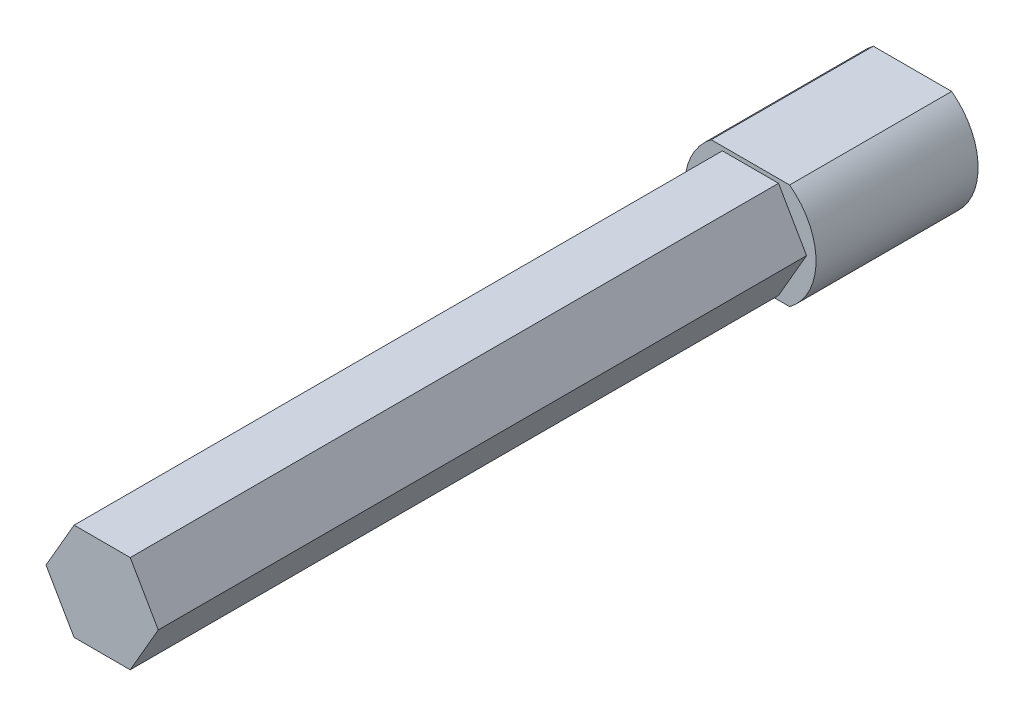
ISO-10303-21;
HEADER;
FILE_DESCRIPTION(('STEP AP214'),'2;1');
FILE_NAME('part.step','',(''),(''),'','','');
FILE_SCHEMA(('AUTOMOTIVE_DESIGN { 1 0 10303 214 1 1 1 1 }'));
ENDSEC;
DATA;
#1=APPLICATION_CONTEXT('core data for automotive mechanical design processes');
#2=APPLICATION_PROTOCOL_DEFINITION('international standard','automotive_design',2000,#1);
#3=PRODUCT_CONTEXT('',#1,'mechanical');
#4=PRODUCT('Part','Part','',(#3));
#5=PRODUCT_RELATED_PRODUCT_CATEGORY('part','',(#4));
#6=PRODUCT_DEFINITION_FORMATION('','',#4);
#7=PRODUCT_DEFINITION_CONTEXT('part definition',#1,'design');
#8=PRODUCT_DEFINITION('design','',#6,#7);
#9=PRODUCT_DEFINITION_SHAPE('','',#8);
#10=(LENGTH_UNIT() NAMED_UNIT(*) SI_UNIT(.MILLI.,.METRE.));
#11=(NAMED_UNIT(*) PLANE_ANGLE_UNIT() SI_UNIT($,.RADIAN.));
#12=(NAMED_UNIT(*) SI_UNIT($,.STERADIAN.) SOLID_ANGLE_UNIT());
#13=UNCERTAINTY_MEASURE_WITH_UNIT(LENGTH_MEASURE(1.E-05),#10,'distance_accuracy_value','');
#14=(GEOMETRIC_REPRESENTATION_CONTEXT(3) GLOBAL_UNCERTAINTY_ASSIGNED_CONTEXT((#13)) GLOBAL_UNIT_ASSIGNED_CONTEXT((#10,
#11,#12)) REPRESENTATION_CONTEXT('',''));
#15=CARTESIAN_POINT('',(0.,0.,0.));
#16=DIRECTION('',(0.,0.,1.));
#17=DIRECTION('',(1.,0.,0.));
#18=AXIS2_PLACEMENT_3D('',#15,#16,#17);
#19=CARTESIAN_POINT('',(0.,0.,10.));
#20=DIRECTION('',(0.,0.,-1.));
#21=DIRECTION('',(-1.,0.,0.));
#22=AXIS2_PLACEMENT_3D('',#19,#20,#21);
#23=CYLINDRICAL_SURFACE('',#22,4.05);
#24=CARTESIAN_POINT('',(0.,0.,0.));
#25=DIRECTION('',(0.,0.,1.));
#26=DIRECTION('',(1.,0.,0.));
#27=AXIS2_PLACEMENT_3D('',#24,#25,#26);
#28=CIRCLE('',#27,4.05);
#29=CARTESIAN_POINT('',(-2.41660919471891,3.25,0.));
#30=VERTEX_POINT('',#29);
#31=CARTESIAN_POINT('',(-2.41660919471891,-3.25,0.));
#32=VERTEX_POINT('',#31);
#33=EDGE_CURVE('E260',#30,#32,#28,.T.);
#34=ORIENTED_EDGE('',*,*,#33,.T.);
#35=DIRECTION('',(0.,0.,-1.));
#36=VECTOR('',#35,1.);
#37=CARTESIAN_POINT('',(-2.41660919471891,-3.25,10.));
#38=LINE('',#37,#36);
#39=CARTESIAN_POINT('',(-2.41660919471891,-3.25,10.));
#40=VERTEX_POINT('',#39);
#41=EDGE_CURVE('E11',#40,#32,#38,.T.);
#42=ORIENTED_EDGE('',*,*,#41,.F.);
#43=CARTESIAN_POINT('',(0.,0.,10.));
#44=DIRECTION('',(0.,0.,1.));
#45=DIRECTION('',(1.,0.,0.));
#46=AXIS2_PLACEMENT_3D('',#43,#44,#45);
#47=CIRCLE('',#46,4.05);
#48=CARTESIAN_POINT('',(-2.41660919471891,3.25,10.));
#49=VERTEX_POINT('',#48);
#50=EDGE_CURVE('E261',#49,#40,#47,.T.);
#51=ORIENTED_EDGE('',*,*,#50,.F.);
#52=DIRECTION('',(0.,0.,-1.));
#53=VECTOR('',#52,1.);
#54=CARTESIAN_POINT('',(-2.41660919471891,3.25,10.));
#55=LINE('',#54,#53);
#56=EDGE_CURVE('E275',#49,#30,#55,.T.);
#57=ORIENTED_EDGE('',*,*,#56,.T.);
#58=EDGE_LOOP('',(#34,#42,#51,#57));
#59=FACE_BOUND('',#58,.T.);
#60=ADVANCED_FACE('F45',(#59),#23,.T.);
#61=CARTESIAN_POINT('',(-2.41660919471891,-3.25,10.));
#62=DIRECTION('',(0.,1.,0.));
#63=DIRECTION('',(0.,0.,1.));
#64=AXIS2_PLACEMENT_3D('',#61,#62,#63);
#65=PLANE('',#64);
#66=DIRECTION('',(1.,0.,0.));
#67=VECTOR('',#66,1.);
#68=CARTESIAN_POINT('',(-2.41660919471891,-3.25,0.));
#69=LINE('',#68,#67);
#70=CARTESIAN_POINT('',(2.41660919471891,-3.25,0.));
#71=VERTEX_POINT('',#70);
#72=EDGE_CURVE('E279',#32,#71,#69,.T.);
#73=ORIENTED_EDGE('',*,*,#72,.T.);
#74=DIRECTION('',(0.,0.,-1.));
#75=VECTOR('',#74,1.);
#76=CARTESIAN_POINT('',(2.41660919471891,-3.25,10.));
#77=LINE('',#76,#75);
#78=CARTESIAN_POINT('',(2.41660919471891,-3.25,10.));
#79=VERTEX_POINT('',#78);
#80=EDGE_CURVE('E53',#79,#71,#77,.T.);
#81=ORIENTED_EDGE('',*,*,#80,.F.);
#82=DIRECTION('',(1.,0.,0.));
#83=VECTOR('',#82,1.);
#84=CARTESIAN_POINT('',(-2.41660919471891,-3.25,10.));
#85=LINE('',#84,#83);
#86=EDGE_CURVE('E265',#40,#79,#85,.T.);
#87=ORIENTED_EDGE('',*,*,#86,.F.);
#88=ORIENTED_EDGE('',*,*,#41,.T.);
#89=EDGE_LOOP('',(#73,#81,#87,#88));
#90=FACE_BOUND('',#89,.T.);
#91=ADVANCED_FACE('F315',(#90),#65,.F.);
#92=CARTESIAN_POINT('',(0.,0.,10.));
#93=DIRECTION('',(0.,0.,-1.));
#94=DIRECTION('',(-1.,0.,0.));
#95=AXIS2_PLACEMENT_3D('',#92,#93,#94);
#96=CYLINDRICAL_SURFACE('',#95,4.05);
#97=CARTESIAN_POINT('',(0.,0.,0.));
#98=DIRECTION('',(0.,0.,1.));
#99=DIRECTION('',(1.,0.,0.));
#100=AXIS2_PLACEMENT_3D('',#97,#98,#99);
#101=CIRCLE('',#100,4.05);
#102=CARTESIAN_POINT('',(2.41660919471891,3.25,0.));
#103=VERTEX_POINT('',#102);
#104=EDGE_CURVE('E282',#71,#103,#101,.T.);
#105=ORIENTED_EDGE('',*,*,#104,.T.);
#106=DIRECTION('',(0.,0.,-1.));
#107=VECTOR('',#106,1.);
#108=CARTESIAN_POINT('',(2.41660919471891,3.25,10.));
#109=LINE('',#108,#107);
#110=CARTESIAN_POINT('',(2.41660919471891,3.25,10.));
#111=VERTEX_POINT('',#110);
#112=EDGE_CURVE('E290',#111,#103,#109,.T.);
#113=ORIENTED_EDGE('',*,*,#112,.F.);
#114=CARTESIAN_POINT('',(0.,0.,10.));
#115=DIRECTION('',(0.,0.,1.));
#116=DIRECTION('',(1.,0.,0.));
#117=AXIS2_PLACEMENT_3D('',#114,#115,#116);
#118=CIRCLE('',#117,4.05);
#119=EDGE_CURVE('E269',#79,#111,#118,.T.);
#120=ORIENTED_EDGE('',*,*,#119,.F.);
#121=ORIENTED_EDGE('',*,*,#80,.T.);
#122=EDGE_LOOP('',(#105,#113,#120,#121));
#123=FACE_BOUND('',#122,.T.);
#124=ADVANCED_FACE('F299',(#123),#96,.T.);
#125=CARTESIAN_POINT('',(-2.41660919471891,3.25,10.));
#126=DIRECTION('',(0.,-1.,0.));
#127=DIRECTION('',(0.,0.,-1.));
#128=AXIS2_PLACEMENT_3D('',#125,#126,#127);
#129=PLANE('',#128);
#130=DIRECTION('',(-1.,0.,0.));
#131=VECTOR('',#130,1.);
#132=CARTESIAN_POINT('',(-2.41660919471891,3.25,0.));
#133=LINE('',#132,#131);
#134=EDGE_CURVE('E266',#103,#30,#133,.T.);
#135=ORIENTED_EDGE('',*,*,#134,.T.);
#136=ORIENTED_EDGE('',*,*,#56,.F.);
#137=DIRECTION('',(-1.,0.,0.));
#138=VECTOR('',#137,1.);
#139=CARTESIAN_POINT('',(-2.41660919471891,3.25,10.));
#140=LINE('',#139,#138);
#141=EDGE_CURVE('E272',#111,#49,#140,.T.);
#142=ORIENTED_EDGE('',*,*,#141,.F.);
#143=ORIENTED_EDGE('',*,*,#112,.T.);
#144=EDGE_LOOP('',(#135,#136,#142,#143));
#145=FACE_BOUND('',#144,.T.);
#146=ADVANCED_FACE('F308',(#145),#129,.F.);
#147=CARTESIAN_POINT('',(0.,0.,10.));
#148=DIRECTION('',(0.,0.,1.));
#149=DIRECTION('',(1.,0.,0.));
#150=AXIS2_PLACEMENT_3D('',#147,#148,#149);
#151=PLANE('',#150);
#152=DIRECTION('',(0.999999819928611,-0.000600118943034689,0.));
#153=VECTOR('',#152,1.);
#154=CARTESIAN_POINT('',(-1.73385085250519,-2.99896002328591,10.));
#155=LINE('',#154,#153);
#156=CARTESIAN_POINT('',(-1.73385085250519,-2.99896002328591,10.));
#157=VERTEX_POINT('',#156);
#158=CARTESIAN_POINT('',(1.73025013884698,-3.00103889628575,10.));
#159=VERTEX_POINT('',#158);
#160=EDGE_CURVE('E68',#157,#159,#155,.T.);
#161=ORIENTED_EDGE('',*,*,#160,.F.);
#162=DIRECTION('',(0.499480191714345,-0.866325307309559,0.));
#163=VECTOR('',#162,1.);
#164=CARTESIAN_POINT('',(-3.46410099135217,0.00207887299984251,10.));
#165=LINE('',#164,#163);
#166=CARTESIAN_POINT('',(-3.46410099135217,0.00207887299984251,10.));
#167=VERTEX_POINT('',#166);
#168=EDGE_CURVE('E201',#167,#157,#165,.T.);
#169=ORIENTED_EDGE('',*,*,#168,.F.);
#170=DIRECTION('',(-0.500519628214266,-0.865725188366524,0.));
#171=VECTOR('',#170,1.);
#172=CARTESIAN_POINT('',(-1.73025013884698,3.00103889628575,10.));
#173=LINE('',#172,#171);
#174=CARTESIAN_POINT('',(-1.73025013884698,3.00103889628575,10.));
#175=VERTEX_POINT('',#174);
#176=EDGE_CURVE('E231',#175,#167,#173,.T.);
#177=ORIENTED_EDGE('',*,*,#176,.F.);
#178=DIRECTION('',(-0.999999819928611,0.000600118943034564,0.));
#179=VECTOR('',#178,1.);
#180=CARTESIAN_POINT('',(1.73385085250519,2.99896002328591,10.));
#181=LINE('',#180,#179);
#182=CARTESIAN_POINT('',(1.73385085250519,2.99896002328591,10.));
#183=VERTEX_POINT('',#182);
#184=EDGE_CURVE('E227',#183,#175,#181,.T.);
#185=ORIENTED_EDGE('',*,*,#184,.F.);
#186=DIRECTION('',(-0.499480191714345,0.866325307309558,0.));
#187=VECTOR('',#186,1.);
#188=CARTESIAN_POINT('',(3.46410099135216,-0.00207887299984231,10.));
#189=LINE('',#188,#187);
#190=CARTESIAN_POINT('',(3.46410099135216,-0.00207887299984231,10.));
#191=VERTEX_POINT('',#190);
#192=EDGE_CURVE('E223',#191,#183,#189,.T.);
#193=ORIENTED_EDGE('',*,*,#192,.F.);
#194=DIRECTION('',(0.500519628214266,0.865725188366524,0.));
#195=VECTOR('',#194,1.);
#196=CARTESIAN_POINT('',(1.73025013884698,-3.00103889628575,10.));
#197=LINE('',#196,#195);
#198=EDGE_CURVE('E219',#159,#191,#197,.T.);
#199=ORIENTED_EDGE('',*,*,#198,.F.);
#200=EDGE_LOOP('',(#161,#169,#177,#185,#193,#199));
#201=FACE_BOUND('',#200,.T.);
#202=ORIENTED_EDGE('',*,*,#50,.T.);
#203=ORIENTED_EDGE('',*,*,#86,.T.);
#204=ORIENTED_EDGE('',*,*,#119,.T.);
#205=ORIENTED_EDGE('',*,*,#141,.T.);
#206=EDGE_LOOP('',(#202,#203,#204,#205));
#207=FACE_BOUND('',#206,.T.);
#208=ADVANCED_FACE('F314',(#201,#207),#151,.T.);
#209=CARTESIAN_POINT('',(0.,0.,0.));
#210=DIRECTION('',(0.,0.,1.));
#211=DIRECTION('',(1.,0.,0.));
#212=AXIS2_PLACEMENT_3D('',#209,#210,#211);
#213=PLANE('',#212);
#214=DIRECTION('',(1.,0.,0.));
#215=VECTOR('',#214,1.);
#216=CARTESIAN_POINT('',(-2.1540659228538,2.5,0.));
#217=LINE('',#216,#215);
#218=CARTESIAN_POINT('',(-2.1540659228538,2.5,0.));
#219=VERTEX_POINT('',#218);
#220=CARTESIAN_POINT('',(2.1540659228538,2.5,0.));
#221=VERTEX_POINT('',#220);
#222=EDGE_CURVE('E182',#219,#221,#217,.T.);
#223=ORIENTED_EDGE('',*,*,#222,.F.);
#224=CARTESIAN_POINT('',(0.,0.,0.));
#225=DIRECTION('',(0.,0.,-1.));
#226=DIRECTION('',(-1.,0.,0.));
#227=AXIS2_PLACEMENT_3D('',#224,#225,#226);
#228=CIRCLE('',#227,3.3);
#229=CARTESIAN_POINT('',(-2.1540659228538,-2.5,0.));
#230=VERTEX_POINT('',#229);
#231=EDGE_CURVE('E60',#230,#219,#228,.T.);
#232=ORIENTED_EDGE('',*,*,#231,.F.);
#233=DIRECTION('',(-1.,0.,0.));
#234=VECTOR('',#233,1.);
#235=CARTESIAN_POINT('',(2.1540659228538,-2.5,0.));
#236=LINE('',#235,#234);
#237=CARTESIAN_POINT('',(2.1540659228538,-2.5,0.));
#238=VERTEX_POINT('',#237);
#239=EDGE_CURVE('E169',#238,#230,#236,.T.);
#240=ORIENTED_EDGE('',*,*,#239,.F.);
#241=CARTESIAN_POINT('',(0.,0.,0.));
#242=DIRECTION('',(0.,0.,-1.));
#243=DIRECTION('',(-1.,0.,0.));
#244=AXIS2_PLACEMENT_3D('',#241,#242,#243);
#245=CIRCLE('',#244,3.3);
#246=EDGE_CURVE('E173',#221,#238,#245,.T.);
#247=ORIENTED_EDGE('',*,*,#246,.F.);
#248=EDGE_LOOP('',(#223,#232,#240,#247));
#249=FACE_BOUND('',#248,.T.);
#250=ORIENTED_EDGE('',*,*,#33,.F.);
#251=ORIENTED_EDGE('',*,*,#134,.F.);
#252=ORIENTED_EDGE('',*,*,#104,.F.);
#253=ORIENTED_EDGE('',*,*,#72,.F.);
#254=EDGE_LOOP('',(#250,#251,#252,#253));
#255=FACE_BOUND('',#254,.T.);
#256=ADVANCED_FACE('F305',(#249,#255),#213,.F.);
#257=CARTESIAN_POINT('',(-1.73385085250519,-2.99896002328591,50.));
#258=DIRECTION('',(0.000600118943034689,0.999999819928611,0.));
#259=DIRECTION('',(-0.999999819928611,0.000600118943034689,0.));
#260=AXIS2_PLACEMENT_3D('',#257,#258,#259);
#261=PLANE('',#260);
#262=ORIENTED_EDGE('',*,*,#160,.T.);
#263=DIRECTION('',(0.,0.,-1.));
#264=VECTOR('',#263,1.);
#265=CARTESIAN_POINT('',(1.73025013884698,-3.00103889628575,50.));
#266=LINE('',#265,#264);
#267=CARTESIAN_POINT('',(1.73025013884698,-3.00103889628575,50.));
#268=VERTEX_POINT('',#267);
#269=EDGE_CURVE('E256',#268,#159,#266,.T.);
#270=ORIENTED_EDGE('',*,*,#269,.F.);
#271=DIRECTION('',(0.999999819928611,-0.000600118943034689,0.));
#272=VECTOR('',#271,1.);
#273=CARTESIAN_POINT('',(-1.73385085250519,-2.99896002328591,50.));
#274=LINE('',#273,#272);
#275=CARTESIAN_POINT('',(-1.73385085250519,-2.99896002328591,50.));
#276=VERTEX_POINT('',#275);
#277=EDGE_CURVE('E196',#276,#268,#274,.T.);
#278=ORIENTED_EDGE('',*,*,#277,.F.);
#279=DIRECTION('',(0.,0.,-1.));
#280=VECTOR('',#279,1.);
#281=CARTESIAN_POINT('',(-1.73385085250519,-2.99896002328591,50.));
#282=LINE('',#281,#280);
#283=EDGE_CURVE('E216',#276,#157,#282,.T.);
#284=ORIENTED_EDGE('',*,*,#283,.T.);
#285=EDGE_LOOP('',(#262,#270,#278,#284));
#286=FACE_BOUND('',#285,.T.);
#287=ADVANCED_FACE('F327',(#286),#261,.F.);
#288=CARTESIAN_POINT('',(1.73025013884698,-3.00103889628575,50.));
#289=DIRECTION('',(-0.865725188366524,0.500519628214266,0.));
#290=DIRECTION('',(-0.500519628214266,-0.865725188366524,0.));
#291=AXIS2_PLACEMENT_3D('',#288,#289,#290);
#292=PLANE('',#291);
#293=ORIENTED_EDGE('',*,*,#198,.T.);
#294=DIRECTION('',(0.,0.,-1.));
#295=VECTOR('',#294,1.);
#296=CARTESIAN_POINT('',(3.46410099135216,-0.00207887299984231,50.));
#297=LINE('',#296,#295);
#298=CARTESIAN_POINT('',(3.46410099135216,-0.00207887299984231,50.));
#299=VERTEX_POINT('',#298);
#300=EDGE_CURVE('E252',#299,#191,#297,.T.);
#301=ORIENTED_EDGE('',*,*,#300,.F.);
#302=DIRECTION('',(0.500519628214266,0.865725188366524,0.));
#303=VECTOR('',#302,1.);
#304=CARTESIAN_POINT('',(1.73025013884698,-3.00103889628575,50.));
#305=LINE('',#304,#303);
#306=EDGE_CURVE('E200',#268,#299,#305,.T.);
#307=ORIENTED_EDGE('',*,*,#306,.F.);
#308=ORIENTED_EDGE('',*,*,#269,.T.);
#309=EDGE_LOOP('',(#293,#301,#307,#308));
#310=FACE_BOUND('',#309,.T.);
#311=ADVANCED_FACE('F333',(#310),#292,.F.);
#312=CARTESIAN_POINT('',(3.46410099135216,-0.00207887299984231,50.));
#313=DIRECTION('',(-0.866325307309558,-0.499480191714345,0.));
#314=DIRECTION('',(0.499480191714345,-0.866325307309558,0.));
#315=AXIS2_PLACEMENT_3D('',#312,#313,#314);
#316=PLANE('',#315);
#317=ORIENTED_EDGE('',*,*,#192,.T.);
#318=DIRECTION('',(0.,0.,-1.));
#319=VECTOR('',#318,1.);
#320=CARTESIAN_POINT('',(1.73385085250519,2.99896002328591,50.));
#321=LINE('',#320,#319);
#322=CARTESIAN_POINT('',(1.73385085250519,2.99896002328591,50.));
#323=VERTEX_POINT('',#322);
#324=EDGE_CURVE('E248',#323,#183,#321,.T.);
#325=ORIENTED_EDGE('',*,*,#324,.F.);
#326=DIRECTION('',(-0.499480191714345,0.866325307309558,0.));
#327=VECTOR('',#326,1.);
#328=CARTESIAN_POINT('',(3.46410099135216,-0.00207887299984231,50.));
#329=LINE('',#328,#327);
#330=EDGE_CURVE('E204',#299,#323,#329,.T.);
#331=ORIENTED_EDGE('',*,*,#330,.F.);
#332=ORIENTED_EDGE('',*,*,#300,.T.);
#333=EDGE_LOOP('',(#317,#325,#331,#332));
#334=FACE_BOUND('',#333,.T.);
#335=ADVANCED_FACE('F337',(#334),#316,.F.);
#336=CARTESIAN_POINT('',(1.73385085250519,2.99896002328591,50.));
#337=DIRECTION('',(-0.000600118943034564,-0.999999819928611,0.));
#338=DIRECTION('',(0.999999819928611,-0.000600118943034564,0.));
#339=AXIS2_PLACEMENT_3D('',#336,#337,#338);
#340=PLANE('',#339);
#341=ORIENTED_EDGE('',*,*,#184,.T.);
#342=DIRECTION('',(0.,0.,-1.));
#343=VECTOR('',#342,1.);
#344=CARTESIAN_POINT('',(-1.73025013884698,3.00103889628575,50.));
#345=LINE('',#344,#343);
#346=CARTESIAN_POINT('',(-1.73025013884698,3.00103889628575,50.));
#347=VERTEX_POINT('',#346);
#348=EDGE_CURVE('E244',#347,#175,#345,.T.);
#349=ORIENTED_EDGE('',*,*,#348,.F.);
#350=DIRECTION('',(-0.999999819928611,0.000600118943034564,0.));
#351=VECTOR('',#350,1.);
#352=CARTESIAN_POINT('',(1.73385085250519,2.99896002328591,50.));
#353=LINE('',#352,#351);
#354=EDGE_CURVE('E207',#323,#347,#353,.T.);
#355=ORIENTED_EDGE('',*,*,#354,.F.);
#356=ORIENTED_EDGE('',*,*,#324,.T.);
#357=EDGE_LOOP('',(#341,#349,#355,#356));
#358=FACE_BOUND('',#357,.T.);
#359=ADVANCED_FACE('F341',(#358),#340,.F.);
#360=CARTESIAN_POINT('',(-1.73025013884698,3.00103889628575,50.));
#361=DIRECTION('',(0.865725188366524,-0.500519628214266,0.));
#362=DIRECTION('',(0.500519628214266,0.865725188366524,0.));
#363=AXIS2_PLACEMENT_3D('',#360,#361,#362);
#364=PLANE('',#363);
#365=ORIENTED_EDGE('',*,*,#176,.T.);
#366=DIRECTION('',(0.,0.,-1.));
#367=VECTOR('',#366,1.);
#368=CARTESIAN_POINT('',(-3.46410099135217,0.00207887299984251,50.));
#369=LINE('',#368,#367);
#370=CARTESIAN_POINT('',(-3.46410099135217,0.00207887299984251,50.));
#371=VERTEX_POINT('',#370);
#372=EDGE_CURVE('E240',#371,#167,#369,.T.);
#373=ORIENTED_EDGE('',*,*,#372,.F.);
#374=DIRECTION('',(-0.500519628214266,-0.865725188366524,0.));
#375=VECTOR('',#374,1.);
#376=CARTESIAN_POINT('',(-1.73025013884698,3.00103889628575,50.));
#377=LINE('',#376,#375);
#378=EDGE_CURVE('E210',#347,#371,#377,.T.);
#379=ORIENTED_EDGE('',*,*,#378,.F.);
#380=ORIENTED_EDGE('',*,*,#348,.T.);
#381=EDGE_LOOP('',(#365,#373,#379,#380));
#382=FACE_BOUND('',#381,.T.);
#383=ADVANCED_FACE('F345',(#382),#364,.F.);
#384=CARTESIAN_POINT('',(-3.46410099135217,0.00207887299984251,50.));
#385=DIRECTION('',(0.866325307309559,0.499480191714345,0.));
#386=DIRECTION('',(-0.499480191714345,0.866325307309559,0.));
#387=AXIS2_PLACEMENT_3D('',#384,#385,#386);
#388=PLANE('',#387);
#389=ORIENTED_EDGE('',*,*,#168,.T.);
#390=ORIENTED_EDGE('',*,*,#283,.F.);
#391=DIRECTION('',(0.499480191714345,-0.866325307309559,0.));
#392=VECTOR('',#391,1.);
#393=CARTESIAN_POINT('',(-3.46410099135217,0.00207887299984251,50.));
#394=LINE('',#393,#392);
#395=EDGE_CURVE('E213',#371,#276,#394,.T.);
#396=ORIENTED_EDGE('',*,*,#395,.F.);
#397=ORIENTED_EDGE('',*,*,#372,.T.);
#398=EDGE_LOOP('',(#389,#390,#396,#397));
#399=FACE_BOUND('',#398,.T.);
#400=ADVANCED_FACE('F349',(#399),#388,.F.);
#401=CARTESIAN_POINT('',(0.,0.,50.));
#402=DIRECTION('',(0.,0.,1.));
#403=DIRECTION('',(1.,0.,0.));
#404=AXIS2_PLACEMENT_3D('',#401,#402,#403);
#405=PLANE('',#404);
#406=ORIENTED_EDGE('',*,*,#277,.T.);
#407=ORIENTED_EDGE('',*,*,#306,.T.);
#408=ORIENTED_EDGE('',*,*,#330,.T.);
#409=ORIENTED_EDGE('',*,*,#354,.T.);
#410=ORIENTED_EDGE('',*,*,#378,.T.);
#411=ORIENTED_EDGE('',*,*,#395,.T.);
#412=EDGE_LOOP('',(#406,#407,#408,#409,#410,#411));
#413=FACE_BOUND('',#412,.T.);
#414=ADVANCED_FACE('F353',(#413),#405,.T.);
#415=CARTESIAN_POINT('',(0.,0.,5.));
#416=DIRECTION('',(0.,0.,-1.));
#417=DIRECTION('',(-1.,0.,0.));
#418=AXIS2_PLACEMENT_3D('',#415,#416,#417);
#419=CYLINDRICAL_SURFACE('',#418,3.3);
#420=ORIENTED_EDGE('',*,*,#231,.T.);
#421=DIRECTION('',(0.,0.,-1.));
#422=VECTOR('',#421,1.);
#423=CARTESIAN_POINT('',(-2.1540659228538,2.5,5.));
#424=LINE('',#423,#422);
#425=CARTESIAN_POINT('',(-2.1540659228538,2.5,5.));
#426=VERTEX_POINT('',#425);
#427=EDGE_CURVE('E144',#426,#219,#424,.T.);
#428=ORIENTED_EDGE('',*,*,#427,.F.);
#429=CARTESIAN_POINT('',(0.,0.,5.));
#430=DIRECTION('',(0.,0.,-1.));
#431=DIRECTION('',(-1.,0.,0.));
#432=AXIS2_PLACEMENT_3D('',#429,#430,#431);
#433=CIRCLE('',#432,3.3);
#434=CARTESIAN_POINT('',(-2.1540659228538,-2.5,5.));
#435=VERTEX_POINT('',#434);
#436=EDGE_CURVE('E148',#435,#426,#433,.T.);
#437=ORIENTED_EDGE('',*,*,#436,.F.);
#438=DIRECTION('',(0.,0.,-1.));
#439=VECTOR('',#438,1.);
#440=CARTESIAN_POINT('',(-2.1540659228538,-2.5,5.));
#441=LINE('',#440,#439);
#442=EDGE_CURVE('E188',#435,#230,#441,.T.);
#443=ORIENTED_EDGE('',*,*,#442,.T.);
#444=EDGE_LOOP('',(#420,#428,#437,#443));
#445=FACE_BOUND('',#444,.T.);
#446=ADVANCED_FACE('F146',(#445),#419,.F.);
#447=CARTESIAN_POINT('',(2.1540659228538,-2.5,5.));
#448=DIRECTION('',(0.,-1.,0.));
#449=DIRECTION('',(0.,0.,-1.));
#450=AXIS2_PLACEMENT_3D('',#447,#448,#449);
#451=PLANE('',#450);
#452=ORIENTED_EDGE('',*,*,#239,.T.);
#453=ORIENTED_EDGE('',*,*,#442,.F.);
#454=DIRECTION('',(-1.,0.,0.));
#455=VECTOR('',#454,1.);
#456=CARTESIAN_POINT('',(2.1540659228538,-2.5,5.));
#457=LINE('',#456,#455);
#458=CARTESIAN_POINT('',(2.1540659228538,-2.5,5.));
#459=VERTEX_POINT('',#458);
#460=EDGE_CURVE('E155',#459,#435,#457,.T.);
#461=ORIENTED_EDGE('',*,*,#460,.F.);
#462=DIRECTION('',(0.,0.,-1.));
#463=VECTOR('',#462,1.);
#464=CARTESIAN_POINT('',(2.1540659228538,-2.5,5.));
#465=LINE('',#464,#463);
#466=EDGE_CURVE('E191',#459,#238,#465,.T.);
#467=ORIENTED_EDGE('',*,*,#466,.T.);
#468=EDGE_LOOP('',(#452,#453,#461,#467));
#469=FACE_BOUND('',#468,.T.);
#470=ADVANCED_FACE('F360',(#469),#451,.F.);
#471=CARTESIAN_POINT('',(0.,0.,5.));
#472=DIRECTION('',(0.,0.,-1.));
#473=DIRECTION('',(-1.,0.,0.));
#474=AXIS2_PLACEMENT_3D('',#471,#472,#473);
#475=CYLINDRICAL_SURFACE('',#474,3.3);
#476=ORIENTED_EDGE('',*,*,#246,.T.);
#477=ORIENTED_EDGE('',*,*,#466,.F.);
#478=CARTESIAN_POINT('',(0.,0.,5.));
#479=DIRECTION('',(0.,0.,-1.));
#480=DIRECTION('',(-1.,0.,0.));
#481=AXIS2_PLACEMENT_3D('',#478,#479,#480);
#482=CIRCLE('',#481,3.3);
#483=CARTESIAN_POINT('',(2.1540659228538,2.5,5.));
#484=VERTEX_POINT('',#483);
#485=EDGE_CURVE('E164',#484,#459,#482,.T.);
#486=ORIENTED_EDGE('',*,*,#485,.F.);
#487=DIRECTION('',(0.,0.,-1.));
#488=VECTOR('',#487,1.);
#489=CARTESIAN_POINT('',(2.1540659228538,2.5,5.));
#490=LINE('',#489,#488);
#491=EDGE_CURVE('E154',#484,#221,#490,.T.);
#492=ORIENTED_EDGE('',*,*,#491,.T.);
#493=EDGE_LOOP('',(#476,#477,#486,#492));
#494=FACE_BOUND('',#493,.T.);
#495=ADVANCED_FACE('F363',(#494),#475,.F.);
#496=CARTESIAN_POINT('',(-2.1540659228538,2.5,5.));
#497=DIRECTION('',(0.,1.,0.));
#498=DIRECTION('',(0.,0.,1.));
#499=AXIS2_PLACEMENT_3D('',#496,#497,#498);
#500=PLANE('',#499);
#501=ORIENTED_EDGE('',*,*,#222,.T.);
#502=ORIENTED_EDGE('',*,*,#491,.F.);
#503=DIRECTION('',(1.,0.,0.));
#504=VECTOR('',#503,1.);
#505=CARTESIAN_POINT('',(-2.1540659228538,2.5,5.));
#506=LINE('',#505,#504);
#507=EDGE_CURVE('E158',#426,#484,#506,.T.);
#508=ORIENTED_EDGE('',*,*,#507,.F.);
#509=ORIENTED_EDGE('',*,*,#427,.T.);
#510=EDGE_LOOP('',(#501,#502,#508,#509));
#511=FACE_BOUND('',#510,.T.);
#512=ADVANCED_FACE('F159',(#511),#500,.F.);
#513=CARTESIAN_POINT('',(0.,0.,5.));
#514=DIRECTION('',(0.,0.,-1.));
#515=DIRECTION('',(-1.,0.,0.));
#516=AXIS2_PLACEMENT_3D('',#513,#514,#515);
#517=PLANE('',#516);
#518=ORIENTED_EDGE('',*,*,#436,.T.);
#519=ORIENTED_EDGE('',*,*,#507,.T.);
#520=ORIENTED_EDGE('',*,*,#485,.T.);
#521=ORIENTED_EDGE('',*,*,#460,.T.);
#522=EDGE_LOOP('',(#518,#519,#520,#521));
#523=FACE_BOUND('',#522,.T.);
#524=ADVANCED_FACE('F166',(#523),#517,.T.);
#525=CLOSED_SHELL('',(#60,#91,#124,#146,#208,#256,#287,#311,#335,#359,#383,#400,#414,#446,#470,
#495,#512,#524));
#526=MANIFOLD_SOLID_BREP('B2',#525);
#527=ADVANCED_BREP_SHAPE_REPRESENTATION('',(#18,#526),#14);
#528=SHAPE_DEFINITION_REPRESENTATION(#9,#527);
ENDSEC;
END-ISO-10303-21;
